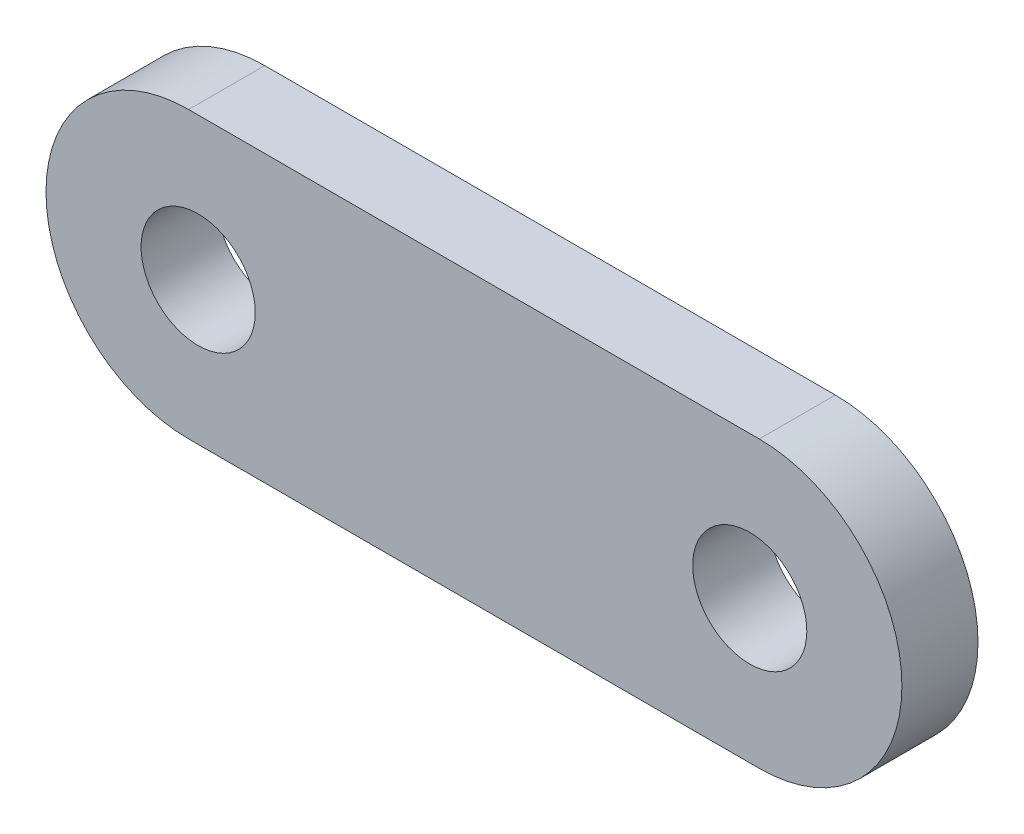
ISO-10303-21;
HEADER;
FILE_DESCRIPTION(('STEP AP214'),'2;1');
FILE_NAME('part.step','',(''),(''),'','','');
FILE_SCHEMA(('AUTOMOTIVE_DESIGN { 1 0 10303 214 1 1 1 1 }'));
ENDSEC;
DATA;
#1=APPLICATION_CONTEXT('core data for automotive mechanical design processes');
#2=APPLICATION_PROTOCOL_DEFINITION('international standard','automotive_design',2000,#1);
#3=PRODUCT_CONTEXT('',#1,'mechanical');
#4=PRODUCT('Part','Part','',(#3));
#5=PRODUCT_RELATED_PRODUCT_CATEGORY('part','',(#4));
#6=PRODUCT_DEFINITION_FORMATION('','',#4);
#7=PRODUCT_DEFINITION_CONTEXT('part definition',#1,'design');
#8=PRODUCT_DEFINITION('design','',#6,#7);
#9=PRODUCT_DEFINITION_SHAPE('','',#8);
#10=(LENGTH_UNIT() NAMED_UNIT(*) SI_UNIT(.MILLI.,.METRE.));
#11=(NAMED_UNIT(*) PLANE_ANGLE_UNIT() SI_UNIT($,.RADIAN.));
#12=(NAMED_UNIT(*) SI_UNIT($,.STERADIAN.) SOLID_ANGLE_UNIT());
#13=UNCERTAINTY_MEASURE_WITH_UNIT(LENGTH_MEASURE(1.E-05),#10,'distance_accuracy_value','');
#14=(GEOMETRIC_REPRESENTATION_CONTEXT(3) GLOBAL_UNCERTAINTY_ASSIGNED_CONTEXT((#13)) GLOBAL_UNIT_ASSIGNED_CONTEXT((#10,
#11,#12)) REPRESENTATION_CONTEXT('',''));
#15=CARTESIAN_POINT('',(0.,0.,0.));
#16=DIRECTION('',(0.,0.,1.));
#17=DIRECTION('',(1.,0.,0.));
#18=AXIS2_PLACEMENT_3D('',#15,#16,#17);
#19=CARTESIAN_POINT('',(7.48856789833,7.5,4.));
#20=DIRECTION('',(0.,0.,1.));
#21=DIRECTION('',(1.,0.,0.));
#22=AXIS2_PLACEMENT_3D('',#19,#20,#21);
#23=PLANE('',#22);
#24=CARTESIAN_POINT('',(7.98856789833,7.5,4.));
#25=DIRECTION('',(0.,0.,1.));
#26=DIRECTION('',(1.,0.,0.));
#27=AXIS2_PLACEMENT_3D('',#24,#25,#26);
#28=CIRCLE('',#27,3.);
#29=CARTESIAN_POINT('',(10.98856789833,7.5,4.));
#30=VERTEX_POINT('',#29);
#31=EDGE_CURVE('E102',#30,#30,#28,.T.);
#32=ORIENTED_EDGE('',*,*,#31,.F.);
#33=EDGE_LOOP('',(#32));
#34=FACE_BOUND('',#33,.T.);
#35=CARTESIAN_POINT('',(7.48856789833,7.5,4.));
#36=DIRECTION('',(0.,0.,1.));
#37=DIRECTION('',(1.,0.,0.));
#38=AXIS2_PLACEMENT_3D('',#35,#36,#37);
#39=CIRCLE('',#38,7.5);
#40=CARTESIAN_POINT('',(7.48856789833,15.,4.));
#41=VERTEX_POINT('',#40);
#42=CARTESIAN_POINT('',(7.48856789833,0.,4.));
#43=VERTEX_POINT('',#42);
#44=EDGE_CURVE('E87',#41,#43,#39,.T.);
#45=ORIENTED_EDGE('',*,*,#44,.T.);
#46=DIRECTION('',(1.,0.,0.));
#47=VECTOR('',#46,1.);
#48=CARTESIAN_POINT('',(7.48856789833,0.,4.));
#49=LINE('',#48,#47);
#50=CARTESIAN_POINT('',(37.48856789833,0.,4.));
#51=VERTEX_POINT('',#50);
#52=EDGE_CURVE('E82',#43,#51,#49,.T.);
#53=ORIENTED_EDGE('',*,*,#52,.T.);
#54=CARTESIAN_POINT('',(37.48856789833,7.5,4.));
#55=DIRECTION('',(0.,0.,1.));
#56=DIRECTION('',(1.,0.,0.));
#57=AXIS2_PLACEMENT_3D('',#54,#55,#56);
#58=CIRCLE('',#57,7.5);
#59=CARTESIAN_POINT('',(37.48856789833,15.,4.));
#60=VERTEX_POINT('',#59);
#61=EDGE_CURVE('E85',#51,#60,#58,.T.);
#62=ORIENTED_EDGE('',*,*,#61,.T.);
#63=DIRECTION('',(-1.,0.,0.));
#64=VECTOR('',#63,1.);
#65=CARTESIAN_POINT('',(7.48856789833,15.,4.));
#66=LINE('',#65,#64);
#67=EDGE_CURVE('E52',#60,#41,#66,.T.);
#68=ORIENTED_EDGE('',*,*,#67,.T.);
#69=EDGE_LOOP('',(#45,#53,#62,#68));
#70=FACE_BOUND('',#69,.T.);
#71=CARTESIAN_POINT('',(36.98856789833,7.5,4.));
#72=DIRECTION('',(0.,0.,1.));
#73=DIRECTION('',(1.,0.,0.));
#74=AXIS2_PLACEMENT_3D('',#71,#72,#73);
#75=CIRCLE('',#74,3.);
#76=CARTESIAN_POINT('',(39.98856789833,7.5,4.));
#77=VERTEX_POINT('',#76);
#78=EDGE_CURVE('E117',#77,#77,#75,.T.);
#79=ORIENTED_EDGE('',*,*,#78,.F.);
#80=EDGE_LOOP('',(#79));
#81=FACE_BOUND('',#80,.T.);
#82=ADVANCED_FACE('F35',(#34,#70,#81),#23,.T.);
#83=CARTESIAN_POINT('',(7.48856789833,7.5,0.));
#84=DIRECTION('',(0.,0.,1.));
#85=DIRECTION('',(1.,0.,0.));
#86=AXIS2_PLACEMENT_3D('',#83,#84,#85);
#87=PLANE('',#86);
#88=CARTESIAN_POINT('',(7.48856789833,7.5,0.));
#89=DIRECTION('',(0.,0.,1.));
#90=DIRECTION('',(1.,0.,0.));
#91=AXIS2_PLACEMENT_3D('',#88,#89,#90);
#92=CIRCLE('',#91,7.5);
#93=CARTESIAN_POINT('',(7.48856789833,15.,0.));
#94=VERTEX_POINT('',#93);
#95=CARTESIAN_POINT('',(7.48856789833,0.,0.));
#96=VERTEX_POINT('',#95);
#97=EDGE_CURVE('E99',#94,#96,#92,.T.);
#98=ORIENTED_EDGE('',*,*,#97,.F.);
#99=DIRECTION('',(-1.,0.,0.));
#100=VECTOR('',#99,1.);
#101=CARTESIAN_POINT('',(7.48856789833,15.,0.));
#102=LINE('',#101,#100);
#103=CARTESIAN_POINT('',(37.48856789833,15.,0.));
#104=VERTEX_POINT('',#103);
#105=EDGE_CURVE('E75',#104,#94,#102,.T.);
#106=ORIENTED_EDGE('',*,*,#105,.F.);
#107=CARTESIAN_POINT('',(37.48856789833,7.5,0.));
#108=DIRECTION('',(0.,0.,1.));
#109=DIRECTION('',(1.,0.,0.));
#110=AXIS2_PLACEMENT_3D('',#107,#108,#109);
#111=CIRCLE('',#110,7.5);
#112=CARTESIAN_POINT('',(37.48856789833,0.,0.));
#113=VERTEX_POINT('',#112);
#114=EDGE_CURVE('E69',#113,#104,#111,.T.);
#115=ORIENTED_EDGE('',*,*,#114,.F.);
#116=DIRECTION('',(1.,0.,0.));
#117=VECTOR('',#116,1.);
#118=CARTESIAN_POINT('',(7.48856789833,0.,0.));
#119=LINE('',#118,#117);
#120=EDGE_CURVE('E91',#96,#113,#119,.T.);
#121=ORIENTED_EDGE('',*,*,#120,.F.);
#122=EDGE_LOOP('',(#98,#106,#115,#121));
#123=FACE_BOUND('',#122,.T.);
#124=CARTESIAN_POINT('',(7.98856789833,7.5,0.));
#125=DIRECTION('',(0.,0.,1.));
#126=DIRECTION('',(1.,0.,0.));
#127=AXIS2_PLACEMENT_3D('',#124,#125,#126);
#128=CIRCLE('',#127,3.);
#129=CARTESIAN_POINT('',(10.98856789833,7.5,0.));
#130=VERTEX_POINT('',#129);
#131=EDGE_CURVE('E114',#130,#130,#128,.T.);
#132=ORIENTED_EDGE('',*,*,#131,.T.);
#133=EDGE_LOOP('',(#132));
#134=FACE_BOUND('',#133,.T.);
#135=CARTESIAN_POINT('',(36.98856789833,7.5,0.));
#136=DIRECTION('',(0.,0.,1.));
#137=DIRECTION('',(1.,0.,0.));
#138=AXIS2_PLACEMENT_3D('',#135,#136,#137);
#139=CIRCLE('',#138,3.);
#140=CARTESIAN_POINT('',(39.98856789833,7.5,0.));
#141=VERTEX_POINT('',#140);
#142=EDGE_CURVE('E120',#141,#141,#139,.T.);
#143=ORIENTED_EDGE('',*,*,#142,.T.);
#144=EDGE_LOOP('',(#143));
#145=FACE_BOUND('',#144,.T.);
#146=ADVANCED_FACE('F110',(#123,#134,#145),#87,.F.);
#147=CARTESIAN_POINT('',(7.48856789833,7.5,4.));
#148=DIRECTION('',(0.,0.,-1.));
#149=DIRECTION('',(-1.,0.,0.));
#150=AXIS2_PLACEMENT_3D('',#147,#148,#149);
#151=CYLINDRICAL_SURFACE('',#150,7.5);
#152=ORIENTED_EDGE('',*,*,#97,.T.);
#153=DIRECTION('',(0.,0.,-1.));
#154=VECTOR('',#153,1.);
#155=CARTESIAN_POINT('',(7.48856789833,0.,4.));
#156=LINE('',#155,#154);
#157=EDGE_CURVE('E11',#43,#96,#156,.T.);
#158=ORIENTED_EDGE('',*,*,#157,.F.);
#159=ORIENTED_EDGE('',*,*,#44,.F.);
#160=DIRECTION('',(0.,0.,-1.));
#161=VECTOR('',#160,1.);
#162=CARTESIAN_POINT('',(7.48856789833,15.,4.));
#163=LINE('',#162,#161);
#164=EDGE_CURVE('E95',#41,#94,#163,.T.);
#165=ORIENTED_EDGE('',*,*,#164,.T.);
#166=EDGE_LOOP('',(#152,#158,#159,#165));
#167=FACE_BOUND('',#166,.T.);
#168=ADVANCED_FACE('F37',(#167),#151,.T.);
#169=CARTESIAN_POINT('',(7.48856789833,0.,4.));
#170=DIRECTION('',(0.,1.,0.));
#171=DIRECTION('',(0.,0.,1.));
#172=AXIS2_PLACEMENT_3D('',#169,#170,#171);
#173=PLANE('',#172);
#174=ORIENTED_EDGE('',*,*,#120,.T.);
#175=DIRECTION('',(0.,0.,-1.));
#176=VECTOR('',#175,1.);
#177=CARTESIAN_POINT('',(37.48856789833,0.,4.));
#178=LINE('',#177,#176);
#179=EDGE_CURVE('E44',#51,#113,#178,.T.);
#180=ORIENTED_EDGE('',*,*,#179,.F.);
#181=ORIENTED_EDGE('',*,*,#52,.F.);
#182=ORIENTED_EDGE('',*,*,#157,.T.);
#183=EDGE_LOOP('',(#174,#180,#181,#182));
#184=FACE_BOUND('',#183,.T.);
#185=ADVANCED_FACE('F90',(#184),#173,.F.);
#186=CARTESIAN_POINT('',(37.48856789833,7.5,4.));
#187=DIRECTION('',(0.,0.,-1.));
#188=DIRECTION('',(-1.,0.,0.));
#189=AXIS2_PLACEMENT_3D('',#186,#187,#188);
#190=CYLINDRICAL_SURFACE('',#189,7.5);
#191=ORIENTED_EDGE('',*,*,#114,.T.);
#192=DIRECTION('',(0.,0.,-1.));
#193=VECTOR('',#192,1.);
#194=CARTESIAN_POINT('',(37.48856789833,15.,4.));
#195=LINE('',#194,#193);
#196=EDGE_CURVE('E92',#60,#104,#195,.T.);
#197=ORIENTED_EDGE('',*,*,#196,.F.);
#198=ORIENTED_EDGE('',*,*,#61,.F.);
#199=ORIENTED_EDGE('',*,*,#179,.T.);
#200=EDGE_LOOP('',(#191,#197,#198,#199));
#201=FACE_BOUND('',#200,.T.);
#202=ADVANCED_FACE('F93',(#201),#190,.T.);
#203=CARTESIAN_POINT('',(7.48856789833,15.,4.));
#204=DIRECTION('',(0.,-1.,0.));
#205=DIRECTION('',(0.,0.,-1.));
#206=AXIS2_PLACEMENT_3D('',#203,#204,#205);
#207=PLANE('',#206);
#208=ORIENTED_EDGE('',*,*,#105,.T.);
#209=ORIENTED_EDGE('',*,*,#164,.F.);
#210=ORIENTED_EDGE('',*,*,#67,.F.);
#211=ORIENTED_EDGE('',*,*,#196,.T.);
#212=EDGE_LOOP('',(#208,#209,#210,#211));
#213=FACE_BOUND('',#212,.T.);
#214=ADVANCED_FACE('F107',(#213),#207,.F.);
#215=CARTESIAN_POINT('',(7.98856789833,7.5,4.));
#216=DIRECTION('',(0.,0.,-1.));
#217=DIRECTION('',(-1.,0.,0.));
#218=AXIS2_PLACEMENT_3D('',#215,#216,#217);
#219=CYLINDRICAL_SURFACE('',#218,3.);
#220=ORIENTED_EDGE('',*,*,#31,.T.);
#221=EDGE_LOOP('',(#220));
#222=FACE_BOUND('',#221,.T.);
#223=ORIENTED_EDGE('',*,*,#131,.F.);
#224=EDGE_LOOP('',(#223));
#225=FACE_BOUND('',#224,.T.);
#226=ADVANCED_FACE('F137',(#222,#225),#219,.F.);
#227=CARTESIAN_POINT('',(36.98856789833,7.5,4.));
#228=DIRECTION('',(0.,0.,-1.));
#229=DIRECTION('',(-1.,0.,0.));
#230=AXIS2_PLACEMENT_3D('',#227,#228,#229);
#231=CYLINDRICAL_SURFACE('',#230,3.);
#232=ORIENTED_EDGE('',*,*,#78,.T.);
#233=EDGE_LOOP('',(#232));
#234=FACE_BOUND('',#233,.T.);
#235=ORIENTED_EDGE('',*,*,#142,.F.);
#236=EDGE_LOOP('',(#235));
#237=FACE_BOUND('',#236,.T.);
#238=ADVANCED_FACE('F126',(#234,#237),#231,.F.);
#239=CLOSED_SHELL('',(#82,#146,#168,#185,#202,#214,#226,#238));
#240=MANIFOLD_SOLID_BREP('B2',#239);
#241=ADVANCED_BREP_SHAPE_REPRESENTATION('',(#18,#240),#14);
#242=SHAPE_DEFINITION_REPRESENTATION(#9,#241);
ENDSEC;
END-ISO-10303-21;
